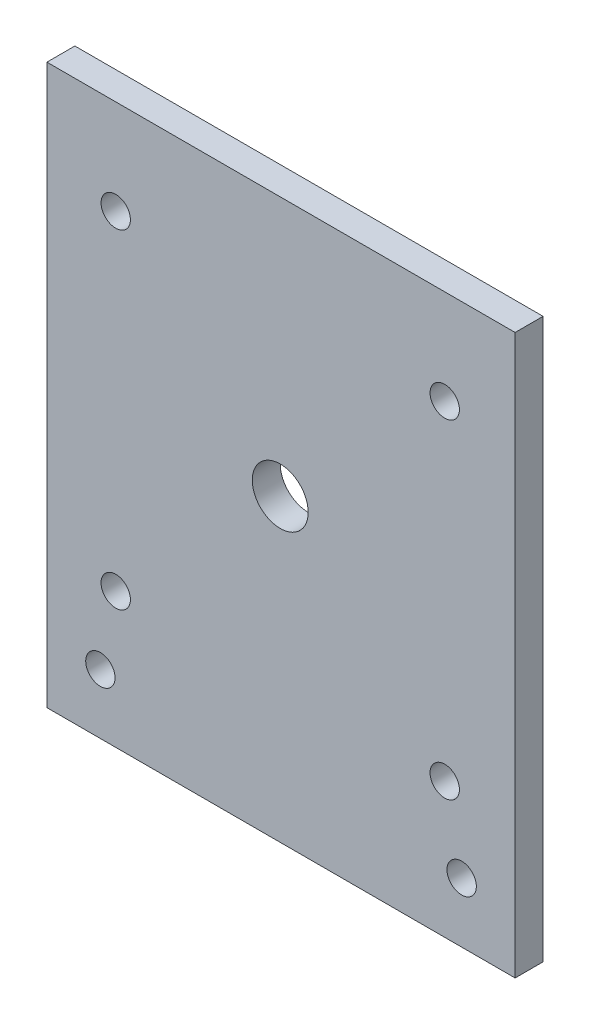
ISO-10303-21;
HEADER;
FILE_DESCRIPTION(('STEP AP214'),'2;1');
FILE_NAME('part.step','',(''),(''),'','','');
FILE_SCHEMA(('AUTOMOTIVE_DESIGN { 1 0 10303 214 1 1 1 1 }'));
ENDSEC;
DATA;
#1=APPLICATION_CONTEXT('core data for automotive mechanical design processes');
#2=APPLICATION_PROTOCOL_DEFINITION('international standard','automotive_design',2000,#1);
#3=PRODUCT_CONTEXT('',#1,'mechanical');
#4=PRODUCT('Part','Part','',(#3));
#5=PRODUCT_RELATED_PRODUCT_CATEGORY('part','',(#4));
#6=PRODUCT_DEFINITION_FORMATION('','',#4);
#7=PRODUCT_DEFINITION_CONTEXT('part definition',#1,'design');
#8=PRODUCT_DEFINITION('design','',#6,#7);
#9=PRODUCT_DEFINITION_SHAPE('','',#8);
#10=(LENGTH_UNIT() NAMED_UNIT(*) SI_UNIT(.MILLI.,.METRE.));
#11=(NAMED_UNIT(*) PLANE_ANGLE_UNIT() SI_UNIT($,.RADIAN.));
#12=(NAMED_UNIT(*) SI_UNIT($,.STERADIAN.) SOLID_ANGLE_UNIT());
#13=UNCERTAINTY_MEASURE_WITH_UNIT(LENGTH_MEASURE(1.E-05),#10,'distance_accuracy_value','');
#14=(GEOMETRIC_REPRESENTATION_CONTEXT(3) GLOBAL_UNCERTAINTY_ASSIGNED_CONTEXT((#13)) GLOBAL_UNIT_ASSIGNED_CONTEXT((#10,
#11,#12)) REPRESENTATION_CONTEXT('',''));
#15=CARTESIAN_POINT('',(0.,0.,0.));
#16=DIRECTION('',(0.,0.,1.));
#17=DIRECTION('',(1.,0.,0.));
#18=AXIS2_PLACEMENT_3D('',#15,#16,#17);
#19=CARTESIAN_POINT('',(32.5,-40.,4.));
#20=DIRECTION('',(0.,1.,0.));
#21=DIRECTION('',(-1.,0.,0.));
#22=AXIS2_PLACEMENT_3D('',#19,#20,#21);
#23=PLANE('',#22);
#24=DIRECTION('',(1.,0.,0.));
#25=VECTOR('',#24,1.);
#26=CARTESIAN_POINT('',(32.5,-40.,0.));
#27=LINE('',#26,#25);
#28=CARTESIAN_POINT('',(-33.5,-40.,0.));
#29=VERTEX_POINT('',#28);
#30=CARTESIAN_POINT('',(33.5,-40.,0.));
#31=VERTEX_POINT('',#30);
#32=EDGE_CURVE('E61',#29,#31,#27,.T.);
#33=ORIENTED_EDGE('',*,*,#32,.T.);
#34=DIRECTION('',(0.,0.,-1.));
#35=VECTOR('',#34,1.);
#36=CARTESIAN_POINT('',(33.5,-40.,4.));
#37=LINE('',#36,#35);
#38=CARTESIAN_POINT('',(33.5,-40.,4.));
#39=VERTEX_POINT('',#38);
#40=EDGE_CURVE('E75',#39,#31,#37,.T.);
#41=ORIENTED_EDGE('',*,*,#40,.F.);
#42=DIRECTION('',(1.,0.,0.));
#43=VECTOR('',#42,1.);
#44=CARTESIAN_POINT('',(32.5,-40.,4.));
#45=LINE('',#44,#43);
#46=CARTESIAN_POINT('',(-33.5,-40.,4.));
#47=VERTEX_POINT('',#46);
#48=EDGE_CURVE('E42',#47,#39,#45,.T.);
#49=ORIENTED_EDGE('',*,*,#48,.F.);
#50=DIRECTION('',(0.,0.,-1.));
#51=VECTOR('',#50,1.);
#52=CARTESIAN_POINT('',(-33.5,-40.,4.));
#53=LINE('',#52,#51);
#54=EDGE_CURVE('E78',#47,#29,#53,.T.);
#55=ORIENTED_EDGE('',*,*,#54,.T.);
#56=EDGE_LOOP('',(#33,#41,#49,#55));
#57=FACE_BOUND('',#56,.T.);
#58=ADVANCED_FACE('F33',(#57),#23,.F.);
#59=CARTESIAN_POINT('',(32.5,40.,4.));
#60=DIRECTION('',(0.,-1.,0.));
#61=DIRECTION('',(1.,0.,0.));
#62=AXIS2_PLACEMENT_3D('',#59,#60,#61);
#63=PLANE('',#62);
#64=DIRECTION('',(-1.,0.,0.));
#65=VECTOR('',#64,1.);
#66=CARTESIAN_POINT('',(32.5,40.,0.));
#67=LINE('',#66,#65);
#68=CARTESIAN_POINT('',(33.5,40.,0.));
#69=VERTEX_POINT('',#68);
#70=CARTESIAN_POINT('',(-33.5,40.,0.));
#71=VERTEX_POINT('',#70);
#72=EDGE_CURVE('E36',#69,#71,#67,.T.);
#73=ORIENTED_EDGE('',*,*,#72,.T.);
#74=DIRECTION('',(0.,0.,-1.));
#75=VECTOR('',#74,1.);
#76=CARTESIAN_POINT('',(-33.5,40.,4.));
#77=LINE('',#76,#75);
#78=CARTESIAN_POINT('',(-33.5,40.,4.));
#79=VERTEX_POINT('',#78);
#80=EDGE_CURVE('E100',#79,#71,#77,.T.);
#81=ORIENTED_EDGE('',*,*,#80,.F.);
#82=DIRECTION('',(-1.,0.,0.));
#83=VECTOR('',#82,1.);
#84=CARTESIAN_POINT('',(32.5,40.,4.));
#85=LINE('',#84,#83);
#86=CARTESIAN_POINT('',(33.5,40.,4.));
#87=VERTEX_POINT('',#86);
#88=EDGE_CURVE('E11',#87,#79,#85,.T.);
#89=ORIENTED_EDGE('',*,*,#88,.F.);
#90=DIRECTION('',(0.,0.,-1.));
#91=VECTOR('',#90,1.);
#92=CARTESIAN_POINT('',(33.5,40.,4.));
#93=LINE('',#92,#91);
#94=EDGE_CURVE('E88',#87,#69,#93,.T.);
#95=ORIENTED_EDGE('',*,*,#94,.T.);
#96=EDGE_LOOP('',(#73,#81,#89,#95));
#97=FACE_BOUND('',#96,.T.);
#98=ADVANCED_FACE('F146',(#97),#63,.F.);
#99=CARTESIAN_POINT('',(0.,0.,4.));
#100=DIRECTION('',(0.,0.,1.));
#101=DIRECTION('',(1.,0.,0.));
#102=AXIS2_PLACEMENT_3D('',#99,#100,#101);
#103=PLANE('',#102);
#104=CARTESIAN_POINT('',(-0.113382838076904,2.900000000022,4.));
#105=DIRECTION('',(0.,0.,1.));
#106=DIRECTION('',(1.,0.,0.));
#107=AXIS2_PLACEMENT_3D('',#104,#105,#106);
#108=CIRCLE('',#107,4.);
#109=CARTESIAN_POINT('',(3.8866171619231,2.900000000022,4.));
#110=VERTEX_POINT('',#109);
#111=EDGE_CURVE('E103',#110,#110,#108,.T.);
#112=ORIENTED_EDGE('',*,*,#111,.F.);
#113=EDGE_LOOP('',(#112));
#114=FACE_BOUND('',#113,.T.);
#115=CARTESIAN_POINT('',(-23.6533595329352,26.4399766948802,4.));
#116=DIRECTION('',(0.,0.,1.));
#117=DIRECTION('',(1.,0.,0.));
#118=AXIS2_PLACEMENT_3D('',#115,#116,#117);
#119=CIRCLE('',#118,2.1);
#120=CARTESIAN_POINT('',(-21.5533595329352,26.4399766948802,4.));
#121=VERTEX_POINT('',#120);
#122=EDGE_CURVE('E121',#121,#121,#119,.T.);
#123=ORIENTED_EDGE('',*,*,#122,.F.);
#124=EDGE_LOOP('',(#123));
#125=FACE_BOUND('',#124,.T.);
#126=CARTESIAN_POINT('',(23.4265938567814,26.4399766948802,4.));
#127=DIRECTION('',(0.,0.,1.));
#128=DIRECTION('',(1.,0.,0.));
#129=AXIS2_PLACEMENT_3D('',#126,#127,#128);
#130=CIRCLE('',#129,2.1);
#131=CARTESIAN_POINT('',(25.5265938567814,26.4399766948802,4.));
#132=VERTEX_POINT('',#131);
#133=EDGE_CURVE('E115',#132,#132,#130,.T.);
#134=ORIENTED_EDGE('',*,*,#133,.F.);
#135=EDGE_LOOP('',(#134));
#136=FACE_BOUND('',#135,.T.);
#137=CARTESIAN_POINT('',(23.4265938567814,-20.6399766948362,4.));
#138=DIRECTION('',(0.,0.,1.));
#139=DIRECTION('',(1.,0.,0.));
#140=AXIS2_PLACEMENT_3D('',#137,#138,#139);
#141=CIRCLE('',#140,2.1);
#142=CARTESIAN_POINT('',(25.5265938567814,-20.6399766948362,4.));
#143=VERTEX_POINT('',#142);
#144=EDGE_CURVE('E109',#143,#143,#141,.T.);
#145=ORIENTED_EDGE('',*,*,#144,.F.);
#146=EDGE_LOOP('',(#145));
#147=FACE_BOUND('',#146,.T.);
#148=CARTESIAN_POINT('',(-23.6533595329352,-20.6399766948362,4.));
#149=DIRECTION('',(0.,0.,1.));
#150=DIRECTION('',(1.,0.,0.));
#151=AXIS2_PLACEMENT_3D('',#148,#149,#150);
#152=CIRCLE('',#151,2.1);
#153=CARTESIAN_POINT('',(-21.5533595329352,-20.6399766948362,4.));
#154=VERTEX_POINT('',#153);
#155=EDGE_CURVE('E108',#154,#154,#152,.T.);
#156=ORIENTED_EDGE('',*,*,#155,.F.);
#157=EDGE_LOOP('',(#156));
#158=FACE_BOUND('',#157,.T.);
#159=CARTESIAN_POINT('',(-25.8499999999457,-31.439022519732,4.));
#160=DIRECTION('',(0.,0.,-1.));
#161=DIRECTION('',(-1.,0.,0.));
#162=AXIS2_PLACEMENT_3D('',#159,#160,#161);
#163=CIRCLE('',#162,2.1);
#164=CARTESIAN_POINT('',(-27.9499999999457,-31.439022519732,4.));
#165=VERTEX_POINT('',#164);
#166=EDGE_CURVE('E80',#165,#165,#163,.T.);
#167=ORIENTED_EDGE('',*,*,#166,.T.);
#168=EDGE_LOOP('',(#167));
#169=FACE_BOUND('',#168,.T.);
#170=CARTESIAN_POINT('',(25.8499999999456,-31.439022519732,4.));
#171=DIRECTION('',(0.,0.,-1.));
#172=DIRECTION('',(1.,0.,0.));
#173=AXIS2_PLACEMENT_3D('',#170,#171,#172);
#174=CIRCLE('',#173,2.1);
#175=CARTESIAN_POINT('',(27.9499999999456,-31.439022519732,4.));
#176=VERTEX_POINT('',#175);
#177=EDGE_CURVE('E140',#176,#176,#174,.T.);
#178=ORIENTED_EDGE('',*,*,#177,.T.);
#179=EDGE_LOOP('',(#178));
#180=FACE_BOUND('',#179,.T.);
#181=ORIENTED_EDGE('',*,*,#88,.T.);
#182=DIRECTION('',(0.,1.,0.));
#183=VECTOR('',#182,1.);
#184=CARTESIAN_POINT('',(-33.5,-40.,4.));
#185=LINE('',#184,#183);
#186=EDGE_CURVE('E96',#47,#79,#185,.T.);
#187=ORIENTED_EDGE('',*,*,#186,.F.);
#188=ORIENTED_EDGE('',*,*,#48,.T.);
#189=DIRECTION('',(0.,-1.,0.));
#190=VECTOR('',#189,1.);
#191=CARTESIAN_POINT('',(33.5,-40.,4.));
#192=LINE('',#191,#190);
#193=EDGE_CURVE('E86',#87,#39,#192,.T.);
#194=ORIENTED_EDGE('',*,*,#193,.F.);
#195=EDGE_LOOP('',(#181,#187,#188,#194));
#196=FACE_BOUND('',#195,.T.);
#197=ADVANCED_FACE('F149',(#114,#125,#136,#147,#158,#169,#180,#196),#103,.T.);
#198=CARTESIAN_POINT('',(0.,0.,0.));
#199=DIRECTION('',(0.,0.,1.));
#200=DIRECTION('',(1.,0.,0.));
#201=AXIS2_PLACEMENT_3D('',#198,#199,#200);
#202=PLANE('',#201);
#203=CARTESIAN_POINT('',(-0.113382838076904,2.900000000022,0.));
#204=DIRECTION('',(0.,0.,1.));
#205=DIRECTION('',(1.,0.,0.));
#206=AXIS2_PLACEMENT_3D('',#203,#204,#205);
#207=CIRCLE('',#206,4.);
#208=CARTESIAN_POINT('',(3.8866171619231,2.900000000022,0.));
#209=VERTEX_POINT('',#208);
#210=EDGE_CURVE('E124',#209,#209,#207,.T.);
#211=ORIENTED_EDGE('',*,*,#210,.T.);
#212=EDGE_LOOP('',(#211));
#213=FACE_BOUND('',#212,.T.);
#214=CARTESIAN_POINT('',(-23.6533595329352,26.4399766948802,0.));
#215=DIRECTION('',(0.,0.,1.));
#216=DIRECTION('',(1.,0.,0.));
#217=AXIS2_PLACEMENT_3D('',#214,#215,#216);
#218=CIRCLE('',#217,2.1);
#219=CARTESIAN_POINT('',(-21.5533595329352,26.4399766948802,0.));
#220=VERTEX_POINT('',#219);
#221=EDGE_CURVE('E118',#220,#220,#218,.T.);
#222=ORIENTED_EDGE('',*,*,#221,.T.);
#223=EDGE_LOOP('',(#222));
#224=FACE_BOUND('',#223,.T.);
#225=CARTESIAN_POINT('',(23.4265938567814,26.4399766948802,0.));
#226=DIRECTION('',(0.,0.,1.));
#227=DIRECTION('',(1.,0.,0.));
#228=AXIS2_PLACEMENT_3D('',#225,#226,#227);
#229=CIRCLE('',#228,2.1);
#230=CARTESIAN_POINT('',(25.5265938567814,26.4399766948802,0.));
#231=VERTEX_POINT('',#230);
#232=EDGE_CURVE('E112',#231,#231,#229,.T.);
#233=ORIENTED_EDGE('',*,*,#232,.T.);
#234=EDGE_LOOP('',(#233));
#235=FACE_BOUND('',#234,.T.);
#236=CARTESIAN_POINT('',(23.4265938567814,-20.6399766948362,0.));
#237=DIRECTION('',(0.,0.,1.));
#238=DIRECTION('',(1.,0.,0.));
#239=AXIS2_PLACEMENT_3D('',#236,#237,#238);
#240=CIRCLE('',#239,2.1);
#241=CARTESIAN_POINT('',(25.5265938567814,-20.6399766948362,0.));
#242=VERTEX_POINT('',#241);
#243=EDGE_CURVE('E105',#242,#242,#240,.T.);
#244=ORIENTED_EDGE('',*,*,#243,.T.);
#245=EDGE_LOOP('',(#244));
#246=FACE_BOUND('',#245,.T.);
#247=CARTESIAN_POINT('',(-23.6533595329352,-20.6399766948362,0.));
#248=DIRECTION('',(0.,0.,1.));
#249=DIRECTION('',(1.,0.,0.));
#250=AXIS2_PLACEMENT_3D('',#247,#248,#249);
#251=CIRCLE('',#250,2.1);
#252=CARTESIAN_POINT('',(-21.5533595329352,-20.6399766948362,0.));
#253=VERTEX_POINT('',#252);
#254=EDGE_CURVE('E129',#253,#253,#251,.T.);
#255=ORIENTED_EDGE('',*,*,#254,.T.);
#256=EDGE_LOOP('',(#255));
#257=FACE_BOUND('',#256,.T.);
#258=CARTESIAN_POINT('',(-25.8499999999457,-31.439022519732,0.));
#259=DIRECTION('',(0.,0.,-1.));
#260=DIRECTION('',(-1.,0.,0.));
#261=AXIS2_PLACEMENT_3D('',#258,#259,#260);
#262=CIRCLE('',#261,2.1);
#263=CARTESIAN_POINT('',(-27.9499999999457,-31.439022519732,0.));
#264=VERTEX_POINT('',#263);
#265=EDGE_CURVE('E137',#264,#264,#262,.T.);
#266=ORIENTED_EDGE('',*,*,#265,.F.);
#267=EDGE_LOOP('',(#266));
#268=FACE_BOUND('',#267,.T.);
#269=CARTESIAN_POINT('',(25.8499999999456,-31.439022519732,0.));
#270=DIRECTION('',(0.,0.,-1.));
#271=DIRECTION('',(1.,0.,0.));
#272=AXIS2_PLACEMENT_3D('',#269,#270,#271);
#273=CIRCLE('',#272,2.1);
#274=CARTESIAN_POINT('',(27.9499999999456,-31.439022519732,0.));
#275=VERTEX_POINT('',#274);
#276=EDGE_CURVE('E132',#275,#275,#273,.T.);
#277=ORIENTED_EDGE('',*,*,#276,.F.);
#278=EDGE_LOOP('',(#277));
#279=FACE_BOUND('',#278,.T.);
#280=ORIENTED_EDGE('',*,*,#32,.F.);
#281=DIRECTION('',(0.,1.,0.));
#282=VECTOR('',#281,1.);
#283=CARTESIAN_POINT('',(-33.5,-40.,0.));
#284=LINE('',#283,#282);
#285=EDGE_CURVE('E87',#29,#71,#284,.T.);
#286=ORIENTED_EDGE('',*,*,#285,.T.);
#287=ORIENTED_EDGE('',*,*,#72,.F.);
#288=DIRECTION('',(0.,-1.,0.));
#289=VECTOR('',#288,1.);
#290=CARTESIAN_POINT('',(33.5,-40.,0.));
#291=LINE('',#290,#289);
#292=EDGE_CURVE('E85',#69,#31,#291,.T.);
#293=ORIENTED_EDGE('',*,*,#292,.T.);
#294=EDGE_LOOP('',(#280,#286,#287,#293));
#295=FACE_BOUND('',#294,.T.);
#296=ADVANCED_FACE('F90',(#213,#224,#235,#246,#257,#268,#279,#295),#202,.F.);
#297=CARTESIAN_POINT('',(25.8499999999456,-31.439022519732,4.));
#298=DIRECTION('',(0.,0.,-1.));
#299=DIRECTION('',(-1.,0.,0.));
#300=AXIS2_PLACEMENT_3D('',#297,#298,#299);
#301=CYLINDRICAL_SURFACE('',#300,2.1);
#302=ORIENTED_EDGE('',*,*,#177,.F.);
#303=EDGE_LOOP('',(#302));
#304=FACE_BOUND('',#303,.T.);
#305=ORIENTED_EDGE('',*,*,#276,.T.);
#306=EDGE_LOOP('',(#305));
#307=FACE_BOUND('',#306,.T.);
#308=ADVANCED_FACE('F157',(#304,#307),#301,.F.);
#309=CARTESIAN_POINT('',(-25.8499999999457,-31.439022519732,4.));
#310=DIRECTION('',(0.,0.,-1.));
#311=DIRECTION('',(-1.,0.,0.));
#312=AXIS2_PLACEMENT_3D('',#309,#310,#311);
#313=CYLINDRICAL_SURFACE('',#312,2.1);
#314=ORIENTED_EDGE('',*,*,#166,.F.);
#315=EDGE_LOOP('',(#314));
#316=FACE_BOUND('',#315,.T.);
#317=ORIENTED_EDGE('',*,*,#265,.T.);
#318=EDGE_LOOP('',(#317));
#319=FACE_BOUND('',#318,.T.);
#320=ADVANCED_FACE('F225',(#316,#319),#313,.F.);
#321=CARTESIAN_POINT('',(-23.6533595329352,-20.6399766948362,0.));
#322=DIRECTION('',(0.,0.,1.));
#323=DIRECTION('',(1.,0.,0.));
#324=AXIS2_PLACEMENT_3D('',#321,#322,#323);
#325=CYLINDRICAL_SURFACE('',#324,2.1);
#326=ORIENTED_EDGE('',*,*,#254,.F.);
#327=EDGE_LOOP('',(#326));
#328=FACE_BOUND('',#327,.T.);
#329=ORIENTED_EDGE('',*,*,#155,.T.);
#330=EDGE_LOOP('',(#329));
#331=FACE_BOUND('',#330,.T.);
#332=ADVANCED_FACE('F212',(#328,#331),#325,.F.);
#333=CARTESIAN_POINT('',(23.4265938567814,-20.6399766948362,0.));
#334=DIRECTION('',(0.,0.,1.));
#335=DIRECTION('',(1.,0.,0.));
#336=AXIS2_PLACEMENT_3D('',#333,#334,#335);
#337=CYLINDRICAL_SURFACE('',#336,2.1);
#338=ORIENTED_EDGE('',*,*,#243,.F.);
#339=EDGE_LOOP('',(#338));
#340=FACE_BOUND('',#339,.T.);
#341=ORIENTED_EDGE('',*,*,#144,.T.);
#342=EDGE_LOOP('',(#341));
#343=FACE_BOUND('',#342,.T.);
#344=ADVANCED_FACE('F208',(#340,#343),#337,.F.);
#345=CARTESIAN_POINT('',(23.4265938567814,26.4399766948802,0.));
#346=DIRECTION('',(0.,0.,1.));
#347=DIRECTION('',(1.,0.,0.));
#348=AXIS2_PLACEMENT_3D('',#345,#346,#347);
#349=CYLINDRICAL_SURFACE('',#348,2.1);
#350=ORIENTED_EDGE('',*,*,#232,.F.);
#351=EDGE_LOOP('',(#350));
#352=FACE_BOUND('',#351,.T.);
#353=ORIENTED_EDGE('',*,*,#133,.T.);
#354=EDGE_LOOP('',(#353));
#355=FACE_BOUND('',#354,.T.);
#356=ADVANCED_FACE('F211',(#352,#355),#349,.F.);
#357=CARTESIAN_POINT('',(-23.6533595329352,26.4399766948802,0.));
#358=DIRECTION('',(0.,0.,1.));
#359=DIRECTION('',(1.,0.,0.));
#360=AXIS2_PLACEMENT_3D('',#357,#358,#359);
#361=CYLINDRICAL_SURFACE('',#360,2.1);
#362=ORIENTED_EDGE('',*,*,#221,.F.);
#363=EDGE_LOOP('',(#362));
#364=FACE_BOUND('',#363,.T.);
#365=ORIENTED_EDGE('',*,*,#122,.T.);
#366=EDGE_LOOP('',(#365));
#367=FACE_BOUND('',#366,.T.);
#368=ADVANCED_FACE('F216',(#364,#367),#361,.F.);
#369=CARTESIAN_POINT('',(-0.113382838076904,2.900000000022,0.));
#370=DIRECTION('',(0.,0.,1.));
#371=DIRECTION('',(1.,0.,0.));
#372=AXIS2_PLACEMENT_3D('',#369,#370,#371);
#373=CYLINDRICAL_SURFACE('',#372,4.);
#374=ORIENTED_EDGE('',*,*,#210,.F.);
#375=EDGE_LOOP('',(#374));
#376=FACE_BOUND('',#375,.T.);
#377=ORIENTED_EDGE('',*,*,#111,.T.);
#378=EDGE_LOOP('',(#377));
#379=FACE_BOUND('',#378,.T.);
#380=ADVANCED_FACE('F194',(#376,#379),#373,.F.);
#381=CARTESIAN_POINT('',(-33.5,-40.,4.));
#382=DIRECTION('',(-1.,0.,0.));
#383=DIRECTION('',(0.,0.,1.));
#384=AXIS2_PLACEMENT_3D('',#381,#382,#383);
#385=PLANE('',#384);
#386=ORIENTED_EDGE('',*,*,#285,.F.);
#387=ORIENTED_EDGE('',*,*,#54,.F.);
#388=ORIENTED_EDGE('',*,*,#186,.T.);
#389=ORIENTED_EDGE('',*,*,#80,.T.);
#390=EDGE_LOOP('',(#386,#387,#388,#389));
#391=FACE_BOUND('',#390,.T.);
#392=ADVANCED_FACE('F148',(#391),#385,.T.);
#393=CARTESIAN_POINT('',(33.5,-40.,4.));
#394=DIRECTION('',(1.,0.,0.));
#395=DIRECTION('',(0.,0.,-1.));
#396=AXIS2_PLACEMENT_3D('',#393,#394,#395);
#397=PLANE('',#396);
#398=ORIENTED_EDGE('',*,*,#292,.F.);
#399=ORIENTED_EDGE('',*,*,#94,.F.);
#400=ORIENTED_EDGE('',*,*,#193,.T.);
#401=ORIENTED_EDGE('',*,*,#40,.T.);
#402=EDGE_LOOP('',(#398,#399,#400,#401));
#403=FACE_BOUND('',#402,.T.);
#404=ADVANCED_FACE('F83',(#403),#397,.T.);
#405=CLOSED_SHELL('',(#58,#98,#197,#296,#308,#320,#332,#344,#356,#368,#380,#392,#404));
#406=MANIFOLD_SOLID_BREP('B2',#405);
#407=ADVANCED_BREP_SHAPE_REPRESENTATION('',(#18,#406),#14);
#408=SHAPE_DEFINITION_REPRESENTATION(#9,#407);
ENDSEC;
END-ISO-10303-21;
